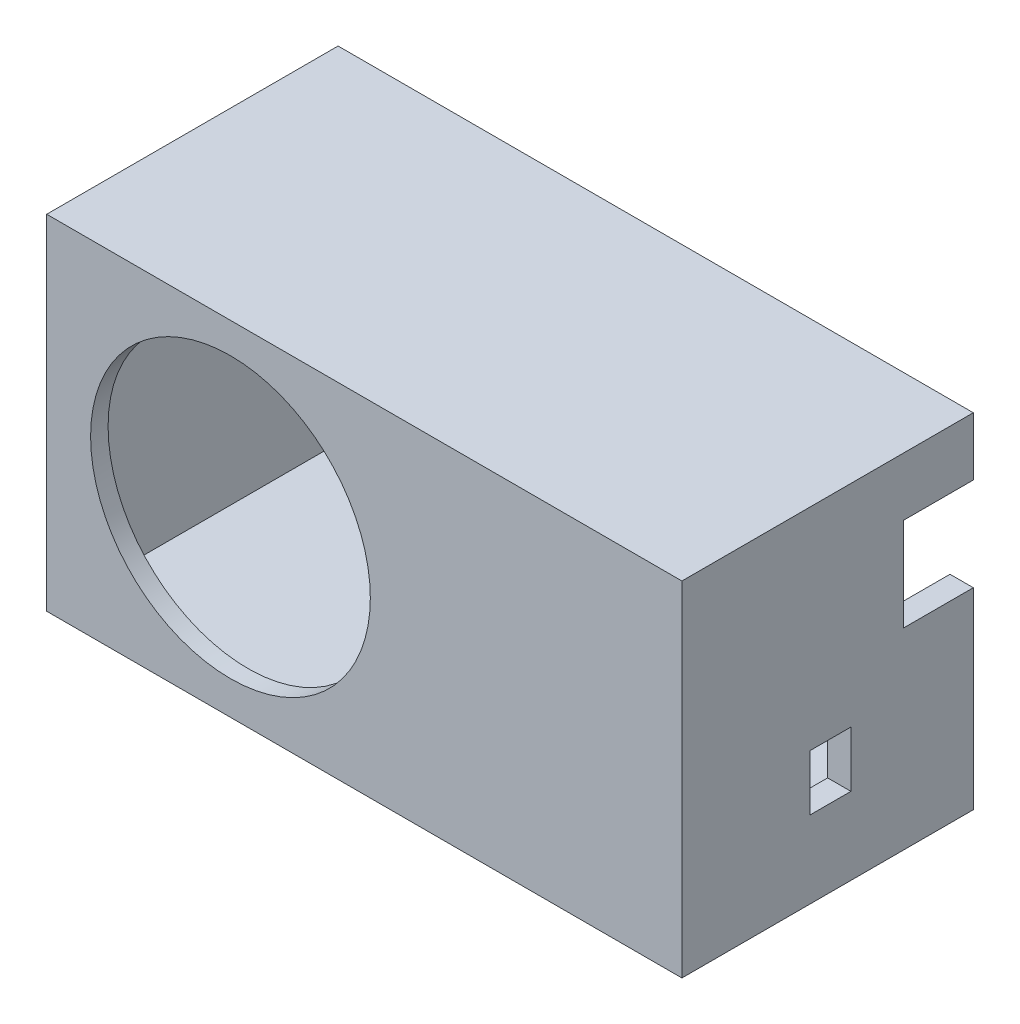
ISO-10303-21;
HEADER;
FILE_DESCRIPTION(('STEP AP214'),'2;1');
FILE_NAME('part.step','',(''),(''),'','','');
FILE_SCHEMA(('AUTOMOTIVE_DESIGN { 1 0 10303 214 1 1 1 1 }'));
ENDSEC;
DATA;
#1=APPLICATION_CONTEXT('core data for automotive mechanical design processes');
#2=APPLICATION_PROTOCOL_DEFINITION('international standard','automotive_design',2000,#1);
#3=PRODUCT_CONTEXT('',#1,'mechanical');
#4=PRODUCT('Part','Part','',(#3));
#5=PRODUCT_RELATED_PRODUCT_CATEGORY('part','',(#4));
#6=PRODUCT_DEFINITION_FORMATION('','',#4);
#7=PRODUCT_DEFINITION_CONTEXT('part definition',#1,'design');
#8=PRODUCT_DEFINITION('design','',#6,#7);
#9=PRODUCT_DEFINITION_SHAPE('','',#8);
#10=(LENGTH_UNIT() NAMED_UNIT(*) SI_UNIT(.MILLI.,.METRE.));
#11=(NAMED_UNIT(*) PLANE_ANGLE_UNIT() SI_UNIT($,.RADIAN.));
#12=(NAMED_UNIT(*) SI_UNIT($,.STERADIAN.) SOLID_ANGLE_UNIT());
#13=UNCERTAINTY_MEASURE_WITH_UNIT(LENGTH_MEASURE(1.E-05),#10,'distance_accuracy_value','');
#14=(GEOMETRIC_REPRESENTATION_CONTEXT(3) GLOBAL_UNCERTAINTY_ASSIGNED_CONTEXT((#13)) GLOBAL_UNIT_ASSIGNED_CONTEXT((#10,
#11,#12)) REPRESENTATION_CONTEXT('',''));
#15=CARTESIAN_POINT('',(0.,0.,0.));
#16=DIRECTION('',(0.,0.,1.));
#17=DIRECTION('',(1.,0.,0.));
#18=AXIS2_PLACEMENT_3D('',#15,#16,#17);
#19=CARTESIAN_POINT('',(0.,0.,0.));
#20=DIRECTION('',(0.,0.,1.));
#21=DIRECTION('',(1.,0.,0.));
#22=AXIS2_PLACEMENT_3D('',#19,#20,#21);
#23=PLANE('',#22);
#24=DIRECTION('',(0.,1.,0.));
#25=VECTOR('',#24,1.);
#26=CARTESIAN_POINT('',(16.6933065151308,-55.,0.));
#27=LINE('',#26,#25);
#28=CARTESIAN_POINT('',(16.6933065151308,-55.,0.));
#29=VERTEX_POINT('',#28);
#30=CARTESIAN_POINT('',(16.6933065151308,-26.,0.));
#31=VERTEX_POINT('',#30);
#32=EDGE_CURVE('E210',#29,#31,#27,.T.);
#33=ORIENTED_EDGE('',*,*,#32,.T.);
#34=DIRECTION('',(1.,0.,0.));
#35=VECTOR('',#34,1.);
#36=CARTESIAN_POINT('',(-21.,-26.,0.));
#37=LINE('',#36,#35);
#38=CARTESIAN_POINT('',(20.6933065151308,-26.,0.));
#39=VERTEX_POINT('',#38);
#40=EDGE_CURVE('E185',#31,#39,#37,.T.);
#41=ORIENTED_EDGE('',*,*,#40,.T.);
#42=DIRECTION('',(0.,1.,0.));
#43=VECTOR('',#42,1.);
#44=CARTESIAN_POINT('',(20.6933065151308,0.,0.));
#45=LINE('',#44,#43);
#46=CARTESIAN_POINT('',(20.6933065151308,-59.,0.));
#47=VERTEX_POINT('',#46);
#48=EDGE_CURVE('E242',#47,#39,#45,.T.);
#49=ORIENTED_EDGE('',*,*,#48,.F.);
#50=DIRECTION('',(1.,0.,0.));
#51=VECTOR('',#50,1.);
#52=CARTESIAN_POINT('',(-88.3066934848692,-59.,0.));
#53=LINE('',#52,#51);
#54=CARTESIAN_POINT('',(-88.3066934848692,-59.,0.));
#55=VERTEX_POINT('',#54);
#56=EDGE_CURVE('E239',#55,#47,#53,.T.);
#57=ORIENTED_EDGE('',*,*,#56,.F.);
#58=DIRECTION('',(0.,-1.,0.));
#59=VECTOR('',#58,1.);
#60=CARTESIAN_POINT('',(-88.3066934848692,0.,0.));
#61=LINE('',#60,#59);
#62=CARTESIAN_POINT('',(-88.3066934848692,0.,0.));
#63=VERTEX_POINT('',#62);
#64=EDGE_CURVE('E225',#63,#55,#61,.T.);
#65=ORIENTED_EDGE('',*,*,#64,.F.);
#66=DIRECTION('',(-1.,0.,0.));
#67=VECTOR('',#66,1.);
#68=CARTESIAN_POINT('',(-88.3066934848692,0.,0.));
#69=LINE('',#68,#67);
#70=CARTESIAN_POINT('',(20.6933065151308,0.,0.));
#71=VERTEX_POINT('',#70);
#72=EDGE_CURVE('E230',#71,#63,#69,.T.);
#73=ORIENTED_EDGE('',*,*,#72,.F.);
#74=CARTESIAN_POINT('',(20.6933065151308,-10.,0.));
#75=VERTEX_POINT('',#74);
#76=EDGE_CURVE('E241',#75,#71,#45,.T.);
#77=ORIENTED_EDGE('',*,*,#76,.F.);
#78=DIRECTION('',(1.,0.,0.));
#79=VECTOR('',#78,1.);
#80=CARTESIAN_POINT('',(-21.,-10.,0.));
#81=LINE('',#80,#79);
#82=CARTESIAN_POINT('',(16.6933065151308,-10.,0.));
#83=VERTEX_POINT('',#82);
#84=EDGE_CURVE('E184',#83,#75,#81,.T.);
#85=ORIENTED_EDGE('',*,*,#84,.F.);
#86=CARTESIAN_POINT('',(16.6933065151308,-4.,0.));
#87=VERTEX_POINT('',#86);
#88=EDGE_CURVE('E209',#83,#87,#27,.T.);
#89=ORIENTED_EDGE('',*,*,#88,.T.);
#90=DIRECTION('',(-1.,0.,0.));
#91=VECTOR('',#90,1.);
#92=CARTESIAN_POINT('',(-84.3066934848692,-4.,0.));
#93=LINE('',#92,#91);
#94=CARTESIAN_POINT('',(-84.3066934848692,-4.,0.));
#95=VERTEX_POINT('',#94);
#96=EDGE_CURVE('E197',#87,#95,#93,.T.);
#97=ORIENTED_EDGE('',*,*,#96,.T.);
#98=DIRECTION('',(0.,-1.,0.));
#99=VECTOR('',#98,1.);
#100=CARTESIAN_POINT('',(-84.3066934848692,-55.,0.));
#101=LINE('',#100,#99);
#102=CARTESIAN_POINT('',(-84.3066934848692,-55.,0.));
#103=VERTEX_POINT('',#102);
#104=EDGE_CURVE('E172',#95,#103,#101,.T.);
#105=ORIENTED_EDGE('',*,*,#104,.T.);
#106=DIRECTION('',(1.,0.,0.));
#107=VECTOR('',#106,1.);
#108=CARTESIAN_POINT('',(-84.3066934848692,-55.,0.));
#109=LINE('',#108,#107);
#110=EDGE_CURVE('E206',#103,#29,#109,.T.);
#111=ORIENTED_EDGE('',*,*,#110,.T.);
#112=EDGE_LOOP('',(#33,#41,#49,#57,#65,#73,#77,#85,#89,#97,#105,#111));
#113=FACE_BOUND('',#112,.T.);
#114=ADVANCED_FACE('F33',(#113),#23,.F.);
#115=CARTESIAN_POINT('',(-88.3066934848692,0.,50.));
#116=DIRECTION('',(1.,0.,0.));
#117=DIRECTION('',(0.,0.,-1.));
#118=AXIS2_PLACEMENT_3D('',#115,#116,#117);
#119=PLANE('',#118);
#120=ORIENTED_EDGE('',*,*,#64,.T.);
#121=DIRECTION('',(0.,0.,-1.));
#122=VECTOR('',#121,1.);
#123=CARTESIAN_POINT('',(-88.3066934848692,-59.,50.));
#124=LINE('',#123,#122);
#125=CARTESIAN_POINT('',(-88.3066934848692,-59.,50.));
#126=VERTEX_POINT('',#125);
#127=EDGE_CURVE('E254',#126,#55,#124,.T.);
#128=ORIENTED_EDGE('',*,*,#127,.F.);
#129=DIRECTION('',(0.,-1.,0.));
#130=VECTOR('',#129,1.);
#131=CARTESIAN_POINT('',(-88.3066934848692,0.,50.));
#132=LINE('',#131,#130);
#133=CARTESIAN_POINT('',(-88.3066934848692,0.,50.));
#134=VERTEX_POINT('',#133);
#135=EDGE_CURVE('E226',#134,#126,#132,.T.);
#136=ORIENTED_EDGE('',*,*,#135,.F.);
#137=DIRECTION('',(0.,0.,-1.));
#138=VECTOR('',#137,1.);
#139=CARTESIAN_POINT('',(-88.3066934848692,0.,50.));
#140=LINE('',#139,#138);
#141=EDGE_CURVE('E236',#134,#63,#140,.T.);
#142=ORIENTED_EDGE('',*,*,#141,.T.);
#143=EDGE_LOOP('',(#120,#128,#136,#142));
#144=FACE_BOUND('',#143,.T.);
#145=ADVANCED_FACE('F35',(#144),#119,.F.);
#146=CARTESIAN_POINT('',(-88.3066934848692,-59.,50.));
#147=DIRECTION('',(0.,1.,0.));
#148=DIRECTION('',(0.,0.,1.));
#149=AXIS2_PLACEMENT_3D('',#146,#147,#148);
#150=PLANE('',#149);
#151=ORIENTED_EDGE('',*,*,#56,.T.);
#152=DIRECTION('',(0.,0.,-1.));
#153=VECTOR('',#152,1.);
#154=CARTESIAN_POINT('',(20.6933065151308,-59.,50.));
#155=LINE('',#154,#153);
#156=CARTESIAN_POINT('',(20.6933065151308,-59.,50.));
#157=VERTEX_POINT('',#156);
#158=EDGE_CURVE('E251',#157,#47,#155,.T.);
#159=ORIENTED_EDGE('',*,*,#158,.F.);
#160=DIRECTION('',(1.,0.,0.));
#161=VECTOR('',#160,1.);
#162=CARTESIAN_POINT('',(-88.3066934848692,-59.,50.));
#163=LINE('',#162,#161);
#164=EDGE_CURVE('E229',#126,#157,#163,.T.);
#165=ORIENTED_EDGE('',*,*,#164,.F.);
#166=ORIENTED_EDGE('',*,*,#127,.T.);
#167=EDGE_LOOP('',(#151,#159,#165,#166));
#168=FACE_BOUND('',#167,.T.);
#169=ADVANCED_FACE('F301',(#168),#150,.F.);
#170=CARTESIAN_POINT('',(20.6933065151308,0.,50.));
#171=DIRECTION('',(-1.,0.,0.));
#172=DIRECTION('',(0.,-1.,0.));
#173=AXIS2_PLACEMENT_3D('',#170,#171,#172);
#174=PLANE('',#173);
#175=DIRECTION('',(0.,1.,0.));
#176=VECTOR('',#175,1.);
#177=CARTESIAN_POINT('',(20.6933065151308,-45.7628574404236,21.));
#178=LINE('',#177,#176);
#179=CARTESIAN_POINT('',(20.6933065151308,-45.7628574404236,21.));
#180=VERTEX_POINT('',#179);
#181=CARTESIAN_POINT('',(20.6933065151308,-36.2033283356583,21.));
#182=VERTEX_POINT('',#181);
#183=EDGE_CURVE('E158',#180,#182,#178,.T.);
#184=ORIENTED_EDGE('',*,*,#183,.F.);
#185=DIRECTION('',(0.,0.,-1.));
#186=VECTOR('',#185,1.);
#187=CARTESIAN_POINT('',(20.6933065151308,-45.7628574404236,28.));
#188=LINE('',#187,#186);
#189=CARTESIAN_POINT('',(20.6933065151308,-45.7628574404236,28.));
#190=VERTEX_POINT('',#189);
#191=EDGE_CURVE('E49',#190,#180,#188,.T.);
#192=ORIENTED_EDGE('',*,*,#191,.F.);
#193=DIRECTION('',(0.,-1.,0.));
#194=VECTOR('',#193,1.);
#195=CARTESIAN_POINT('',(20.6933065151308,-36.2033283356583,28.));
#196=LINE('',#195,#194);
#197=CARTESIAN_POINT('',(20.6933065151308,-36.2033283356583,28.));
#198=VERTEX_POINT('',#197);
#199=EDGE_CURVE('E165',#198,#190,#196,.T.);
#200=ORIENTED_EDGE('',*,*,#199,.F.);
#201=DIRECTION('',(0.,0.,1.));
#202=VECTOR('',#201,1.);
#203=CARTESIAN_POINT('',(20.6933065151308,-36.2033283356583,21.));
#204=LINE('',#203,#202);
#205=EDGE_CURVE('E149',#182,#198,#204,.T.);
#206=ORIENTED_EDGE('',*,*,#205,.F.);
#207=EDGE_LOOP('',(#184,#192,#200,#206));
#208=FACE_BOUND('',#207,.T.);
#209=ORIENTED_EDGE('',*,*,#48,.T.);
#210=DIRECTION('',(0.,0.,-1.));
#211=VECTOR('',#210,1.);
#212=CARTESIAN_POINT('',(20.6933065151308,-26.,12.));
#213=LINE('',#212,#211);
#214=CARTESIAN_POINT('',(20.6933065151308,-26.,12.));
#215=VERTEX_POINT('',#214);
#216=EDGE_CURVE('E182',#215,#39,#213,.T.);
#217=ORIENTED_EDGE('',*,*,#216,.F.);
#218=DIRECTION('',(0.,-1.,0.));
#219=VECTOR('',#218,1.);
#220=CARTESIAN_POINT('',(20.6933065151308,-10.,12.));
#221=LINE('',#220,#219);
#222=CARTESIAN_POINT('',(20.6933065151308,-10.,12.));
#223=VERTEX_POINT('',#222);
#224=EDGE_CURVE('E178',#223,#215,#221,.T.);
#225=ORIENTED_EDGE('',*,*,#224,.F.);
#226=DIRECTION('',(0.,0.,1.));
#227=VECTOR('',#226,1.);
#228=CARTESIAN_POINT('',(20.6933065151308,-10.,0.));
#229=LINE('',#228,#227);
#230=EDGE_CURVE('E175',#75,#223,#229,.T.);
#231=ORIENTED_EDGE('',*,*,#230,.F.);
#232=ORIENTED_EDGE('',*,*,#76,.T.);
#233=DIRECTION('',(0.,0.,-1.));
#234=VECTOR('',#233,1.);
#235=CARTESIAN_POINT('',(20.6933065151308,0.,50.));
#236=LINE('',#235,#234);
#237=CARTESIAN_POINT('',(20.6933065151308,0.,50.));
#238=VERTEX_POINT('',#237);
#239=EDGE_CURVE('E248',#238,#71,#236,.T.);
#240=ORIENTED_EDGE('',*,*,#239,.F.);
#241=DIRECTION('',(0.,1.,0.));
#242=VECTOR('',#241,1.);
#243=CARTESIAN_POINT('',(20.6933065151308,0.,50.));
#244=LINE('',#243,#242);
#245=EDGE_CURVE('E232',#157,#238,#244,.T.);
#246=ORIENTED_EDGE('',*,*,#245,.F.);
#247=ORIENTED_EDGE('',*,*,#158,.T.);
#248=EDGE_LOOP('',(#209,#217,#225,#231,#232,#240,#246,#247));
#249=FACE_BOUND('',#248,.T.);
#250=ADVANCED_FACE('F162',(#208,#249),#174,.F.);
#251=CARTESIAN_POINT('',(-88.3066934848692,0.,50.));
#252=DIRECTION('',(0.,-1.,0.));
#253=DIRECTION('',(0.,0.,-1.));
#254=AXIS2_PLACEMENT_3D('',#251,#252,#253);
#255=PLANE('',#254);
#256=ORIENTED_EDGE('',*,*,#72,.T.);
#257=ORIENTED_EDGE('',*,*,#141,.F.);
#258=DIRECTION('',(-1.,0.,0.));
#259=VECTOR('',#258,1.);
#260=CARTESIAN_POINT('',(-88.3066934848692,0.,50.));
#261=LINE('',#260,#259);
#262=EDGE_CURVE('E234',#238,#134,#261,.T.);
#263=ORIENTED_EDGE('',*,*,#262,.F.);
#264=ORIENTED_EDGE('',*,*,#239,.T.);
#265=EDGE_LOOP('',(#256,#257,#263,#264));
#266=FACE_BOUND('',#265,.T.);
#267=ADVANCED_FACE('F307',(#266),#255,.F.);
#268=CARTESIAN_POINT('',(0.,0.,50.));
#269=DIRECTION('',(0.,0.,1.));
#270=DIRECTION('',(1.,0.,0.));
#271=AXIS2_PLACEMENT_3D('',#268,#269,#270);
#272=PLANE('',#271);
#273=CARTESIAN_POINT('',(-56.7735977794307,-29.2503597359288,50.));
#274=DIRECTION('',(0.,0.,1.));
#275=DIRECTION('',(1.,0.,0.));
#276=AXIS2_PLACEMENT_3D('',#273,#274,#275);
#277=CIRCLE('',#276,24.);
#278=CARTESIAN_POINT('',(-32.7735977794307,-29.2503597359288,50.));
#279=VERTEX_POINT('',#278);
#280=EDGE_CURVE('E179',#279,#279,#277,.F.);
#281=ORIENTED_EDGE('',*,*,#280,.T.);
#282=EDGE_LOOP('',(#281));
#283=FACE_BOUND('',#282,.T.);
#284=ORIENTED_EDGE('',*,*,#135,.T.);
#285=ORIENTED_EDGE('',*,*,#164,.T.);
#286=ORIENTED_EDGE('',*,*,#245,.T.);
#287=ORIENTED_EDGE('',*,*,#262,.T.);
#288=EDGE_LOOP('',(#284,#285,#286,#287));
#289=FACE_BOUND('',#288,.T.);
#290=ADVANCED_FACE('F305',(#283,#289),#272,.T.);
#291=CARTESIAN_POINT('',(-84.3066934848692,-55.,47.));
#292=DIRECTION('',(1.,0.,0.));
#293=DIRECTION('',(0.,0.,-1.));
#294=AXIS2_PLACEMENT_3D('',#291,#292,#293);
#295=PLANE('',#294);
#296=ORIENTED_EDGE('',*,*,#104,.F.);
#297=DIRECTION('',(0.,0.,-1.));
#298=VECTOR('',#297,1.);
#299=CARTESIAN_POINT('',(-84.3066934848692,-4.,47.));
#300=LINE('',#299,#298);
#301=CARTESIAN_POINT('',(-84.3066934848692,-4.,47.));
#302=VERTEX_POINT('',#301);
#303=EDGE_CURVE('E203',#302,#95,#300,.T.);
#304=ORIENTED_EDGE('',*,*,#303,.F.);
#305=DIRECTION('',(0.,-1.,0.));
#306=VECTOR('',#305,1.);
#307=CARTESIAN_POINT('',(-84.3066934848692,-55.,47.));
#308=LINE('',#307,#306);
#309=CARTESIAN_POINT('',(-84.3066934848692,-55.,47.));
#310=VERTEX_POINT('',#309);
#311=EDGE_CURVE('E193',#302,#310,#308,.T.);
#312=ORIENTED_EDGE('',*,*,#311,.T.);
#313=DIRECTION('',(0.,0.,-1.));
#314=VECTOR('',#313,1.);
#315=CARTESIAN_POINT('',(-84.3066934848692,-55.,47.));
#316=LINE('',#315,#314);
#317=EDGE_CURVE('E222',#310,#103,#316,.T.);
#318=ORIENTED_EDGE('',*,*,#317,.T.);
#319=EDGE_LOOP('',(#296,#304,#312,#318));
#320=FACE_BOUND('',#319,.T.);
#321=ADVANCED_FACE('F345',(#320),#295,.T.);
#322=CARTESIAN_POINT('',(-84.3066934848692,-55.,47.));
#323=DIRECTION('',(0.,1.,0.));
#324=DIRECTION('',(0.,0.,1.));
#325=AXIS2_PLACEMENT_3D('',#322,#323,#324);
#326=PLANE('',#325);
#327=ORIENTED_EDGE('',*,*,#110,.F.);
#328=ORIENTED_EDGE('',*,*,#317,.F.);
#329=DIRECTION('',(1.,0.,0.));
#330=VECTOR('',#329,1.);
#331=CARTESIAN_POINT('',(-84.3066934848692,-55.,47.));
#332=LINE('',#331,#330);
#333=CARTESIAN_POINT('',(16.6933065151308,-55.,47.));
#334=VERTEX_POINT('',#333);
#335=EDGE_CURVE('E196',#310,#334,#332,.T.);
#336=ORIENTED_EDGE('',*,*,#335,.T.);
#337=DIRECTION('',(0.,0.,-1.));
#338=VECTOR('',#337,1.);
#339=CARTESIAN_POINT('',(16.6933065151308,-55.,47.));
#340=LINE('',#339,#338);
#341=EDGE_CURVE('E220',#334,#29,#340,.T.);
#342=ORIENTED_EDGE('',*,*,#341,.T.);
#343=EDGE_LOOP('',(#327,#328,#336,#342));
#344=FACE_BOUND('',#343,.T.);
#345=ADVANCED_FACE('F349',(#344),#326,.T.);
#346=CARTESIAN_POINT('',(16.6933065151308,-55.,47.));
#347=DIRECTION('',(-1.,0.,0.));
#348=DIRECTION('',(0.,0.,1.));
#349=AXIS2_PLACEMENT_3D('',#346,#347,#348);
#350=PLANE('',#349);
#351=DIRECTION('',(0.,0.,1.));
#352=VECTOR('',#351,1.);
#353=CARTESIAN_POINT('',(16.6933065151308,-45.7628574404236,47.));
#354=LINE('',#353,#352);
#355=CARTESIAN_POINT('',(16.6933065151308,-45.7628574404236,21.));
#356=VERTEX_POINT('',#355);
#357=CARTESIAN_POINT('',(16.6933065151308,-45.7628574404236,28.));
#358=VERTEX_POINT('',#357);
#359=EDGE_CURVE('E11',#356,#358,#354,.T.);
#360=ORIENTED_EDGE('',*,*,#359,.F.);
#361=DIRECTION('',(0.,-1.,0.));
#362=VECTOR('',#361,1.);
#363=CARTESIAN_POINT('',(16.6933065151308,-55.,21.));
#364=LINE('',#363,#362);
#365=CARTESIAN_POINT('',(16.6933065151308,-36.2033283356583,21.));
#366=VERTEX_POINT('',#365);
#367=EDGE_CURVE('E264',#366,#356,#364,.T.);
#368=ORIENTED_EDGE('',*,*,#367,.F.);
#369=DIRECTION('',(0.,0.,-1.));
#370=VECTOR('',#369,1.);
#371=CARTESIAN_POINT('',(16.6933065151308,-36.2033283356583,47.));
#372=LINE('',#371,#370);
#373=CARTESIAN_POINT('',(16.6933065151308,-36.2033283356583,28.));
#374=VERTEX_POINT('',#373);
#375=EDGE_CURVE('E152',#374,#366,#372,.T.);
#376=ORIENTED_EDGE('',*,*,#375,.F.);
#377=DIRECTION('',(0.,1.,0.));
#378=VECTOR('',#377,1.);
#379=CARTESIAN_POINT('',(16.6933065151308,-55.,28.));
#380=LINE('',#379,#378);
#381=EDGE_CURVE('E42',#358,#374,#380,.T.);
#382=ORIENTED_EDGE('',*,*,#381,.F.);
#383=EDGE_LOOP('',(#360,#368,#376,#382));
#384=FACE_BOUND('',#383,.T.);
#385=DIRECTION('',(0.,0.,1.));
#386=VECTOR('',#385,1.);
#387=CARTESIAN_POINT('',(16.6933065151308,-26.,47.));
#388=LINE('',#387,#386);
#389=CARTESIAN_POINT('',(16.6933065151308,-26.,12.));
#390=VERTEX_POINT('',#389);
#391=EDGE_CURVE('E262',#31,#390,#388,.T.);
#392=ORIENTED_EDGE('',*,*,#391,.F.);
#393=ORIENTED_EDGE('',*,*,#32,.F.);
#394=ORIENTED_EDGE('',*,*,#341,.F.);
#395=DIRECTION('',(0.,1.,0.));
#396=VECTOR('',#395,1.);
#397=CARTESIAN_POINT('',(16.6933065151308,-55.,47.));
#398=LINE('',#397,#396);
#399=CARTESIAN_POINT('',(16.6933065151308,-4.,47.));
#400=VERTEX_POINT('',#399);
#401=EDGE_CURVE('E199',#334,#400,#398,.T.);
#402=ORIENTED_EDGE('',*,*,#401,.T.);
#403=DIRECTION('',(0.,0.,-1.));
#404=VECTOR('',#403,1.);
#405=CARTESIAN_POINT('',(16.6933065151308,-4.,47.));
#406=LINE('',#405,#404);
#407=EDGE_CURVE('E217',#400,#87,#406,.T.);
#408=ORIENTED_EDGE('',*,*,#407,.T.);
#409=ORIENTED_EDGE('',*,*,#88,.F.);
#410=DIRECTION('',(0.,0.,-1.));
#411=VECTOR('',#410,1.);
#412=CARTESIAN_POINT('',(16.6933065151308,-10.,47.));
#413=LINE('',#412,#411);
#414=CARTESIAN_POINT('',(16.6933065151308,-10.,12.));
#415=VERTEX_POINT('',#414);
#416=EDGE_CURVE('E257',#415,#83,#413,.T.);
#417=ORIENTED_EDGE('',*,*,#416,.F.);
#418=DIRECTION('',(0.,1.,0.));
#419=VECTOR('',#418,1.);
#420=CARTESIAN_POINT('',(16.6933065151308,-55.,12.));
#421=LINE('',#420,#419);
#422=EDGE_CURVE('E259',#390,#415,#421,.T.);
#423=ORIENTED_EDGE('',*,*,#422,.F.);
#424=EDGE_LOOP('',(#392,#393,#394,#402,#408,#409,#417,#423));
#425=FACE_BOUND('',#424,.T.);
#426=ADVANCED_FACE('F273',(#384,#425),#350,.T.);
#427=CARTESIAN_POINT('',(-84.3066934848692,-4.,47.));
#428=DIRECTION('',(0.,-1.,0.));
#429=DIRECTION('',(0.,0.,-1.));
#430=AXIS2_PLACEMENT_3D('',#427,#428,#429);
#431=PLANE('',#430);
#432=ORIENTED_EDGE('',*,*,#96,.F.);
#433=ORIENTED_EDGE('',*,*,#407,.F.);
#434=DIRECTION('',(-1.,0.,0.));
#435=VECTOR('',#434,1.);
#436=CARTESIAN_POINT('',(-84.3066934848692,-4.,47.));
#437=LINE('',#436,#435);
#438=EDGE_CURVE('E201',#400,#302,#437,.T.);
#439=ORIENTED_EDGE('',*,*,#438,.T.);
#440=ORIENTED_EDGE('',*,*,#303,.T.);
#441=EDGE_LOOP('',(#432,#433,#439,#440));
#442=FACE_BOUND('',#441,.T.);
#443=ADVANCED_FACE('F359',(#442),#431,.T.);
#444=CARTESIAN_POINT('',(0.,0.,47.));
#445=DIRECTION('',(0.,0.,-1.));
#446=DIRECTION('',(-1.,0.,0.));
#447=AXIS2_PLACEMENT_3D('',#444,#445,#446);
#448=PLANE('',#447);
#449=CARTESIAN_POINT('',(-56.7735977794307,-29.2503597359288,47.));
#450=DIRECTION('',(0.,0.,-1.));
#451=DIRECTION('',(-1.,0.,0.));
#452=AXIS2_PLACEMENT_3D('',#449,#450,#451);
#453=CIRCLE('',#452,24.);
#454=CARTESIAN_POINT('',(-80.7735977794307,-29.2503597359288,47.));
#455=VERTEX_POINT('',#454);
#456=EDGE_CURVE('E37',#455,#455,#453,.F.);
#457=ORIENTED_EDGE('',*,*,#456,.T.);
#458=EDGE_LOOP('',(#457));
#459=FACE_BOUND('',#458,.T.);
#460=ORIENTED_EDGE('',*,*,#311,.F.);
#461=ORIENTED_EDGE('',*,*,#438,.F.);
#462=ORIENTED_EDGE('',*,*,#401,.F.);
#463=ORIENTED_EDGE('',*,*,#335,.F.);
#464=EDGE_LOOP('',(#460,#461,#462,#463));
#465=FACE_BOUND('',#464,.T.);
#466=ADVANCED_FACE('F283',(#459,#465),#448,.T.);
#467=CARTESIAN_POINT('',(-21.,-26.,12.));
#468=DIRECTION('',(0.,-1.,0.));
#469=DIRECTION('',(0.,0.,-1.));
#470=AXIS2_PLACEMENT_3D('',#467,#468,#469);
#471=PLANE('',#470);
#472=ORIENTED_EDGE('',*,*,#391,.T.);
#473=DIRECTION('',(1.,0.,0.));
#474=VECTOR('',#473,1.);
#475=CARTESIAN_POINT('',(-21.,-26.,12.));
#476=LINE('',#475,#474);
#477=EDGE_CURVE('E188',#390,#215,#476,.T.);
#478=ORIENTED_EDGE('',*,*,#477,.T.);
#479=ORIENTED_EDGE('',*,*,#216,.T.);
#480=ORIENTED_EDGE('',*,*,#40,.F.);
#481=EDGE_LOOP('',(#472,#478,#479,#480));
#482=FACE_BOUND('',#481,.T.);
#483=ADVANCED_FACE('F326',(#482),#471,.F.);
#484=CARTESIAN_POINT('',(-21.,-10.,12.));
#485=DIRECTION('',(0.,0.,1.));
#486=DIRECTION('',(0.,-1.,0.));
#487=AXIS2_PLACEMENT_3D('',#484,#485,#486);
#488=PLANE('',#487);
#489=ORIENTED_EDGE('',*,*,#422,.T.);
#490=DIRECTION('',(1.,0.,0.));
#491=VECTOR('',#490,1.);
#492=CARTESIAN_POINT('',(-21.,-10.,12.));
#493=LINE('',#492,#491);
#494=EDGE_CURVE('E190',#415,#223,#493,.T.);
#495=ORIENTED_EDGE('',*,*,#494,.T.);
#496=ORIENTED_EDGE('',*,*,#224,.T.);
#497=ORIENTED_EDGE('',*,*,#477,.F.);
#498=EDGE_LOOP('',(#489,#495,#496,#497));
#499=FACE_BOUND('',#498,.T.);
#500=ADVANCED_FACE('F333',(#499),#488,.F.);
#501=CARTESIAN_POINT('',(-21.,-10.,0.));
#502=DIRECTION('',(0.,1.,0.));
#503=DIRECTION('',(0.,0.,1.));
#504=AXIS2_PLACEMENT_3D('',#501,#502,#503);
#505=PLANE('',#504);
#506=ORIENTED_EDGE('',*,*,#416,.T.);
#507=ORIENTED_EDGE('',*,*,#84,.T.);
#508=ORIENTED_EDGE('',*,*,#230,.T.);
#509=ORIENTED_EDGE('',*,*,#494,.F.);
#510=EDGE_LOOP('',(#506,#507,#508,#509));
#511=FACE_BOUND('',#510,.T.);
#512=ADVANCED_FACE('F365',(#511),#505,.F.);
#513=CARTESIAN_POINT('',(-21.,-45.7628574404236,28.));
#514=DIRECTION('',(0.,-1.,0.));
#515=DIRECTION('',(0.,0.,-1.));
#516=AXIS2_PLACEMENT_3D('',#513,#514,#515);
#517=PLANE('',#516);
#518=ORIENTED_EDGE('',*,*,#359,.T.);
#519=DIRECTION('',(1.,0.,0.));
#520=VECTOR('',#519,1.);
#521=CARTESIAN_POINT('',(-21.,-45.7628574404236,28.));
#522=LINE('',#521,#520);
#523=EDGE_CURVE('E170',#358,#190,#522,.T.);
#524=ORIENTED_EDGE('',*,*,#523,.T.);
#525=ORIENTED_EDGE('',*,*,#191,.T.);
#526=DIRECTION('',(1.,0.,0.));
#527=VECTOR('',#526,1.);
#528=CARTESIAN_POINT('',(-21.,-45.7628574404236,21.));
#529=LINE('',#528,#527);
#530=EDGE_CURVE('E155',#356,#180,#529,.T.);
#531=ORIENTED_EDGE('',*,*,#530,.F.);
#532=EDGE_LOOP('',(#518,#524,#525,#531));
#533=FACE_BOUND('',#532,.T.);
#534=ADVANCED_FACE('F275',(#533),#517,.F.);
#535=CARTESIAN_POINT('',(-21.,-36.2033283356583,28.));
#536=DIRECTION('',(0.,0.,1.));
#537=DIRECTION('',(1.,0.,0.));
#538=AXIS2_PLACEMENT_3D('',#535,#536,#537);
#539=PLANE('',#538);
#540=ORIENTED_EDGE('',*,*,#381,.T.);
#541=DIRECTION('',(1.,0.,0.));
#542=VECTOR('',#541,1.);
#543=CARTESIAN_POINT('',(-21.,-36.2033283356583,28.));
#544=LINE('',#543,#542);
#545=EDGE_CURVE('E154',#374,#198,#544,.T.);
#546=ORIENTED_EDGE('',*,*,#545,.T.);
#547=ORIENTED_EDGE('',*,*,#199,.T.);
#548=ORIENTED_EDGE('',*,*,#523,.F.);
#549=EDGE_LOOP('',(#540,#546,#547,#548));
#550=FACE_BOUND('',#549,.T.);
#551=ADVANCED_FACE('F270',(#550),#539,.F.);
#552=CARTESIAN_POINT('',(-21.,-36.2033283356583,21.));
#553=DIRECTION('',(0.,1.,0.));
#554=DIRECTION('',(0.,0.,1.));
#555=AXIS2_PLACEMENT_3D('',#552,#553,#554);
#556=PLANE('',#555);
#557=ORIENTED_EDGE('',*,*,#375,.T.);
#558=DIRECTION('',(1.,0.,0.));
#559=VECTOR('',#558,1.);
#560=CARTESIAN_POINT('',(-21.,-36.2033283356583,21.));
#561=LINE('',#560,#559);
#562=EDGE_CURVE('E57',#366,#182,#561,.T.);
#563=ORIENTED_EDGE('',*,*,#562,.T.);
#564=ORIENTED_EDGE('',*,*,#205,.T.);
#565=ORIENTED_EDGE('',*,*,#545,.F.);
#566=EDGE_LOOP('',(#557,#563,#564,#565));
#567=FACE_BOUND('',#566,.T.);
#568=ADVANCED_FACE('F146',(#567),#556,.F.);
#569=CARTESIAN_POINT('',(-21.,-45.7628574404236,21.));
#570=DIRECTION('',(0.,0.,-1.));
#571=DIRECTION('',(-1.,0.,0.));
#572=AXIS2_PLACEMENT_3D('',#569,#570,#571);
#573=PLANE('',#572);
#574=ORIENTED_EDGE('',*,*,#367,.T.);
#575=ORIENTED_EDGE('',*,*,#530,.T.);
#576=ORIENTED_EDGE('',*,*,#183,.T.);
#577=ORIENTED_EDGE('',*,*,#562,.F.);
#578=EDGE_LOOP('',(#574,#575,#576,#577));
#579=FACE_BOUND('',#578,.T.);
#580=ADVANCED_FACE('F159',(#579),#573,.F.);
#581=CARTESIAN_POINT('',(-56.7735977794307,-29.2503597359288,73.0000000000001));
#582=DIRECTION('',(0.,0.,-1.));
#583=DIRECTION('',(-1.,0.,0.));
#584=AXIS2_PLACEMENT_3D('',#581,#582,#583);
#585=CYLINDRICAL_SURFACE('',#584,24.);
#586=ORIENTED_EDGE('',*,*,#280,.F.);
#587=EDGE_LOOP('',(#586));
#588=FACE_BOUND('',#587,.T.);
#589=ORIENTED_EDGE('',*,*,#456,.F.);
#590=EDGE_LOOP('',(#589));
#591=FACE_BOUND('',#590,.T.);
#592=ADVANCED_FACE('F286',(#588,#591),#585,.F.);
#593=CLOSED_SHELL('',(#114,#145,#169,#250,#267,#290,#321,#345,#426,#443,#466,#483,#500,#512,
#534,#551,#568,#580,#592));
#594=MANIFOLD_SOLID_BREP('B2',#593);
#595=ADVANCED_BREP_SHAPE_REPRESENTATION('',(#18,#594),#14);
#596=SHAPE_DEFINITION_REPRESENTATION(#9,#595);
ENDSEC;
END-ISO-10303-21;
